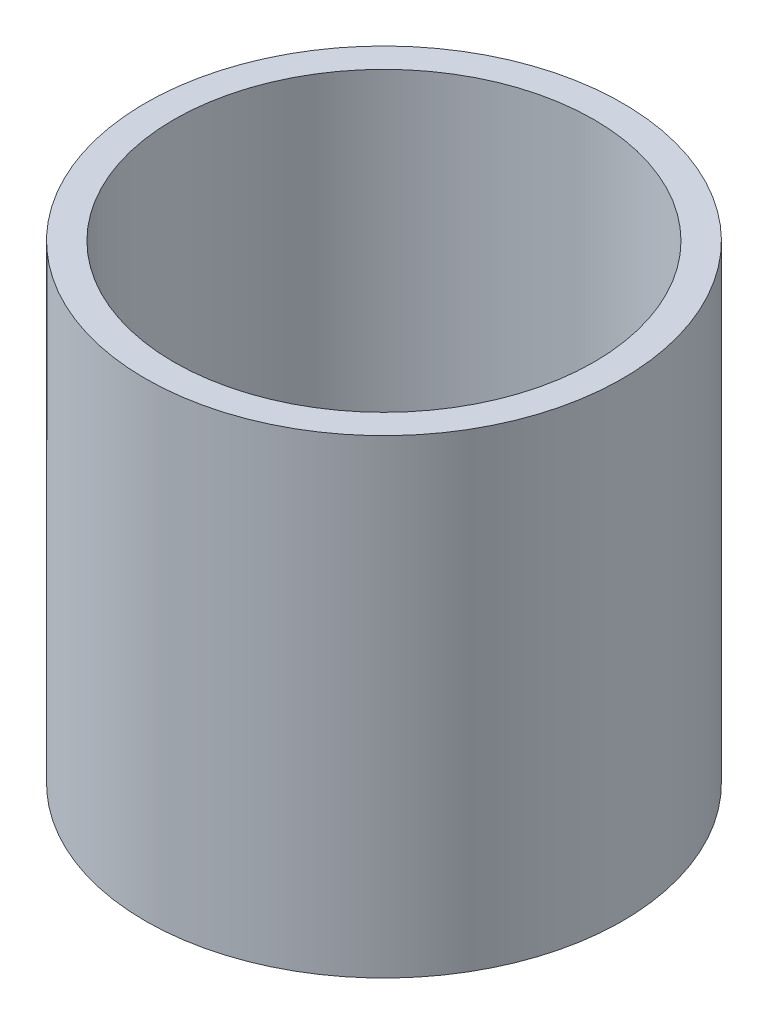
ISO-10303-21;
HEADER;
FILE_DESCRIPTION(('STEP AP214'),'2;1');
FILE_NAME('part.step','',(''),(''),'','','');
FILE_SCHEMA(('AUTOMOTIVE_DESIGN { 1 0 10303 214 1 1 1 1 }'));
ENDSEC;
DATA;
#1=APPLICATION_CONTEXT('core data for automotive mechanical design processes');
#2=APPLICATION_PROTOCOL_DEFINITION('international standard','automotive_design',2000,#1);
#3=PRODUCT_CONTEXT('',#1,'mechanical');
#4=PRODUCT('Part','Part','',(#3));
#5=PRODUCT_RELATED_PRODUCT_CATEGORY('part','',(#4));
#6=PRODUCT_DEFINITION_FORMATION('','',#4);
#7=PRODUCT_DEFINITION_CONTEXT('part definition',#1,'design');
#8=PRODUCT_DEFINITION('design','',#6,#7);
#9=PRODUCT_DEFINITION_SHAPE('','',#8);
#10=(LENGTH_UNIT() NAMED_UNIT(*) SI_UNIT(.MILLI.,.METRE.));
#11=(NAMED_UNIT(*) PLANE_ANGLE_UNIT() SI_UNIT($,.RADIAN.));
#12=(NAMED_UNIT(*) SI_UNIT($,.STERADIAN.) SOLID_ANGLE_UNIT());
#13=UNCERTAINTY_MEASURE_WITH_UNIT(LENGTH_MEASURE(1.E-05),#10,'distance_accuracy_value','');
#14=(GEOMETRIC_REPRESENTATION_CONTEXT(3) GLOBAL_UNCERTAINTY_ASSIGNED_CONTEXT((#13)) GLOBAL_UNIT_ASSIGNED_CONTEXT((#10,
#11,#12)) REPRESENTATION_CONTEXT('',''));
#15=CARTESIAN_POINT('',(0.,0.,0.));
#16=DIRECTION('',(0.,0.,1.));
#17=DIRECTION('',(1.,0.,0.));
#18=AXIS2_PLACEMENT_3D('',#15,#16,#17);
#19=CARTESIAN_POINT('',(0.,100.,0.));
#20=DIRECTION('',(0.,1.,0.));
#21=DIRECTION('',(0.,0.,1.));
#22=AXIS2_PLACEMENT_3D('',#19,#20,#21);
#23=PLANE('',#22);
#24=CARTESIAN_POINT('',(0.,100.,0.));
#25=DIRECTION('',(0.,1.,0.));
#26=DIRECTION('',(0.,0.,1.));
#27=AXIS2_PLACEMENT_3D('',#24,#25,#26);
#28=CIRCLE('',#27,50.8);
#29=CARTESIAN_POINT('',(0.,100.,50.8));
#30=VERTEX_POINT('',#29);
#31=EDGE_CURVE('E10',#30,#30,#28,.T.);
#32=ORIENTED_EDGE('',*,*,#31,.T.);
#33=EDGE_LOOP('',(#32));
#34=FACE_BOUND('',#33,.T.);
#35=CARTESIAN_POINT('',(0.,100.,0.));
#36=DIRECTION('',(0.,1.,0.));
#37=DIRECTION('',(0.,0.,1.));
#38=AXIS2_PLACEMENT_3D('',#35,#36,#37);
#39=CIRCLE('',#38,44.7167);
#40=CARTESIAN_POINT('',(0.,100.,44.7167));
#41=VERTEX_POINT('',#40);
#42=EDGE_CURVE('E41',#41,#41,#39,.T.);
#43=ORIENTED_EDGE('',*,*,#42,.F.);
#44=EDGE_LOOP('',(#43));
#45=FACE_BOUND('',#44,.T.);
#46=ADVANCED_FACE('F30',(#34,#45),#23,.T.);
#47=CARTESIAN_POINT('',(0.,0.,0.));
#48=DIRECTION('',(0.,1.,0.));
#49=DIRECTION('',(0.,0.,1.));
#50=AXIS2_PLACEMENT_3D('',#47,#48,#49);
#51=PLANE('',#50);
#52=CARTESIAN_POINT('',(0.,0.,0.));
#53=DIRECTION('',(0.,1.,0.));
#54=DIRECTION('',(0.,0.,1.));
#55=AXIS2_PLACEMENT_3D('',#52,#53,#54);
#56=CIRCLE('',#55,50.8);
#57=CARTESIAN_POINT('',(0.,0.,50.8));
#58=VERTEX_POINT('',#57);
#59=EDGE_CURVE('E34',#58,#58,#56,.T.);
#60=ORIENTED_EDGE('',*,*,#59,.F.);
#61=EDGE_LOOP('',(#60));
#62=FACE_BOUND('',#61,.T.);
#63=CARTESIAN_POINT('',(0.,0.,0.));
#64=DIRECTION('',(0.,1.,0.));
#65=DIRECTION('',(0.,0.,1.));
#66=AXIS2_PLACEMENT_3D('',#63,#64,#65);
#67=CIRCLE('',#66,44.7167);
#68=CARTESIAN_POINT('',(0.,0.,44.7167));
#69=VERTEX_POINT('',#68);
#70=EDGE_CURVE('E43',#69,#69,#67,.T.);
#71=ORIENTED_EDGE('',*,*,#70,.T.);
#72=EDGE_LOOP('',(#71));
#73=FACE_BOUND('',#72,.T.);
#74=ADVANCED_FACE('F53',(#62,#73),#51,.F.);
#75=CARTESIAN_POINT('',(0.,100.,0.));
#76=DIRECTION('',(0.,-1.,0.));
#77=DIRECTION('',(0.,0.,-1.));
#78=AXIS2_PLACEMENT_3D('',#75,#76,#77);
#79=CYLINDRICAL_SURFACE('',#78,50.8);
#80=ORIENTED_EDGE('',*,*,#31,.F.);
#81=EDGE_LOOP('',(#80));
#82=FACE_BOUND('',#81,.T.);
#83=ORIENTED_EDGE('',*,*,#59,.T.);
#84=EDGE_LOOP('',(#83));
#85=FACE_BOUND('',#84,.T.);
#86=ADVANCED_FACE('F32',(#82,#85),#79,.T.);
#87=CARTESIAN_POINT('',(0.,100.,0.));
#88=DIRECTION('',(0.,-1.,0.));
#89=DIRECTION('',(0.,0.,-1.));
#90=AXIS2_PLACEMENT_3D('',#87,#88,#89);
#91=CYLINDRICAL_SURFACE('',#90,44.7167);
#92=ORIENTED_EDGE('',*,*,#42,.T.);
#93=EDGE_LOOP('',(#92));
#94=FACE_BOUND('',#93,.T.);
#95=ORIENTED_EDGE('',*,*,#70,.F.);
#96=EDGE_LOOP('',(#95));
#97=FACE_BOUND('',#96,.T.);
#98=ADVANCED_FACE('F49',(#94,#97),#91,.F.);
#99=CLOSED_SHELL('',(#46,#74,#86,#98));
#100=MANIFOLD_SOLID_BREP('B2',#99);
#101=ADVANCED_BREP_SHAPE_REPRESENTATION('',(#18,#100),#14);
#102=SHAPE_DEFINITION_REPRESENTATION(#9,#101);
ENDSEC;
END-ISO-10303-21;
